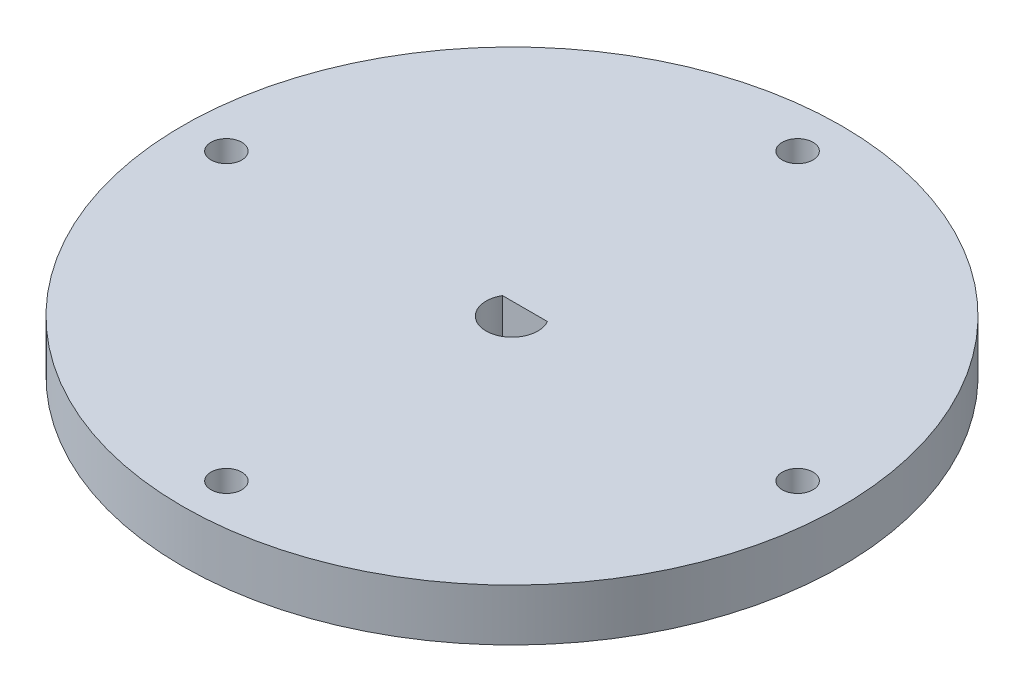
ISO-10303-21;
HEADER;
FILE_DESCRIPTION(('STEP AP214'),'2;1');
FILE_NAME('part.step','',(''),(''),'','','');
FILE_SCHEMA(('AUTOMOTIVE_DESIGN { 1 0 10303 214 1 1 1 1 }'));
ENDSEC;
DATA;
#1=APPLICATION_CONTEXT('core data for automotive mechanical design processes');
#2=APPLICATION_PROTOCOL_DEFINITION('international standard','automotive_design',2000,#1);
#3=PRODUCT_CONTEXT('',#1,'mechanical');
#4=PRODUCT('Part','Part','',(#3));
#5=PRODUCT_RELATED_PRODUCT_CATEGORY('part','',(#4));
#6=PRODUCT_DEFINITION_FORMATION('','',#4);
#7=PRODUCT_DEFINITION_CONTEXT('part definition',#1,'design');
#8=PRODUCT_DEFINITION('design','',#6,#7);
#9=PRODUCT_DEFINITION_SHAPE('','',#8);
#10=(LENGTH_UNIT() NAMED_UNIT(*) SI_UNIT(.MILLI.,.METRE.));
#11=(NAMED_UNIT(*) PLANE_ANGLE_UNIT() SI_UNIT($,.RADIAN.));
#12=(NAMED_UNIT(*) SI_UNIT($,.STERADIAN.) SOLID_ANGLE_UNIT());
#13=UNCERTAINTY_MEASURE_WITH_UNIT(LENGTH_MEASURE(1.E-05),#10,'distance_accuracy_value','');
#14=(GEOMETRIC_REPRESENTATION_CONTEXT(3) GLOBAL_UNCERTAINTY_ASSIGNED_CONTEXT((#13)) GLOBAL_UNIT_ASSIGNED_CONTEXT((#10,
#11,#12)) REPRESENTATION_CONTEXT('',''));
#15=CARTESIAN_POINT('',(0.,0.,0.));
#16=DIRECTION('',(0.,0.,1.));
#17=DIRECTION('',(1.,0.,0.));
#18=AXIS2_PLACEMENT_3D('',#15,#16,#17);
#19=CARTESIAN_POINT('',(0.,6.,0.));
#20=DIRECTION('',(0.,-1.,0.));
#21=DIRECTION('',(0.,0.,-1.));
#22=AXIS2_PLACEMENT_3D('',#19,#20,#21);
#23=CYLINDRICAL_SURFACE('',#22,38.1);
#24=CARTESIAN_POINT('',(0.,6.,0.));
#25=DIRECTION('',(0.,1.,0.));
#26=DIRECTION('',(0.,0.,1.));
#27=AXIS2_PLACEMENT_3D('',#24,#25,#26);
#28=CIRCLE('',#27,38.1);
#29=CARTESIAN_POINT('',(0.,6.,38.1));
#30=VERTEX_POINT('',#29);
#31=EDGE_CURVE('E11',#30,#30,#28,.T.);
#32=ORIENTED_EDGE('',*,*,#31,.F.);
#33=EDGE_LOOP('',(#32));
#34=FACE_BOUND('',#33,.T.);
#35=CARTESIAN_POINT('',(0.,0.,0.));
#36=DIRECTION('',(0.,1.,0.));
#37=DIRECTION('',(0.,0.,1.));
#38=AXIS2_PLACEMENT_3D('',#35,#36,#37);
#39=CIRCLE('',#38,38.1);
#40=CARTESIAN_POINT('',(0.,0.,38.1));
#41=VERTEX_POINT('',#40);
#42=EDGE_CURVE('E38',#41,#41,#39,.T.);
#43=ORIENTED_EDGE('',*,*,#42,.T.);
#44=EDGE_LOOP('',(#43));
#45=FACE_BOUND('',#44,.T.);
#46=ADVANCED_FACE('F35',(#34,#45),#23,.T.);
#47=CARTESIAN_POINT('',(0.,6.,0.));
#48=DIRECTION('',(0.,1.,0.));
#49=DIRECTION('',(0.,0.,1.));
#50=AXIS2_PLACEMENT_3D('',#47,#48,#49);
#51=PLANE('',#50);
#52=CARTESIAN_POINT('',(0.,6.,0.));
#53=DIRECTION('',(0.,1.,0.));
#54=DIRECTION('',(0.,0.,1.));
#55=AXIS2_PLACEMENT_3D('',#52,#53,#54);
#56=CIRCLE('',#55,3.);
#57=CARTESIAN_POINT('',(-2.59807621135332,6.,-1.5));
#58=VERTEX_POINT('',#57);
#59=CARTESIAN_POINT('',(2.59807621135332,6.,-1.5));
#60=VERTEX_POINT('',#59);
#61=EDGE_CURVE('E49',#58,#60,#56,.T.);
#62=ORIENTED_EDGE('',*,*,#61,.F.);
#63=DIRECTION('',(-1.,0.,0.));
#64=VECTOR('',#63,1.);
#65=CARTESIAN_POINT('',(-2.59807621135332,6.,-1.5));
#66=LINE('',#65,#64);
#67=EDGE_CURVE('E69',#60,#58,#66,.T.);
#68=ORIENTED_EDGE('',*,*,#67,.F.);
#69=EDGE_LOOP('',(#62,#68));
#70=FACE_BOUND('',#69,.T.);
#71=CARTESIAN_POINT('',(3.45866141425801E-13,6.,-33.02));
#72=DIRECTION('',(0.,1.,0.));
#73=DIRECTION('',(1.,0.,0.));
#74=AXIS2_PLACEMENT_3D('',#71,#72,#73);
#75=CIRCLE('',#74,1.778);
#76=CARTESIAN_POINT('',(1.77800000000035,6.,-33.02));
#77=VERTEX_POINT('',#76);
#78=EDGE_CURVE('E65',#77,#77,#75,.T.);
#79=ORIENTED_EDGE('',*,*,#78,.F.);
#80=EDGE_LOOP('',(#79));
#81=FACE_BOUND('',#80,.T.);
#82=CARTESIAN_POINT('',(-33.02,6.,0.));
#83=DIRECTION('',(0.,1.,0.));
#84=DIRECTION('',(0.,0.,-1.));
#85=AXIS2_PLACEMENT_3D('',#82,#83,#84);
#86=CIRCLE('',#85,1.778);
#87=CARTESIAN_POINT('',(-33.02,6.,-1.778));
#88=VERTEX_POINT('',#87);
#89=EDGE_CURVE('E84',#88,#88,#86,.T.);
#90=ORIENTED_EDGE('',*,*,#89,.F.);
#91=EDGE_LOOP('',(#90));
#92=FACE_BOUND('',#91,.T.);
#93=CARTESIAN_POINT('',(-1.152887138086E-13,6.,33.02));
#94=DIRECTION('',(0.,1.,0.));
#95=DIRECTION('',(-1.,0.,0.));
#96=AXIS2_PLACEMENT_3D('',#93,#94,#95);
#97=CIRCLE('',#96,1.778);
#98=CARTESIAN_POINT('',(-1.77800000000012,6.,33.02));
#99=VERTEX_POINT('',#98);
#100=EDGE_CURVE('E90',#99,#99,#97,.T.);
#101=ORIENTED_EDGE('',*,*,#100,.F.);
#102=EDGE_LOOP('',(#101));
#103=FACE_BOUND('',#102,.T.);
#104=CARTESIAN_POINT('',(33.02,6.,0.));
#105=DIRECTION('',(0.,1.,0.));
#106=DIRECTION('',(0.,0.,1.));
#107=AXIS2_PLACEMENT_3D('',#104,#105,#106);
#108=CIRCLE('',#107,1.778);
#109=CARTESIAN_POINT('',(33.02,6.,1.778));
#110=VERTEX_POINT('',#109);
#111=EDGE_CURVE('E96',#110,#110,#108,.T.);
#112=ORIENTED_EDGE('',*,*,#111,.F.);
#113=EDGE_LOOP('',(#112));
#114=FACE_BOUND('',#113,.T.);
#115=ORIENTED_EDGE('',*,*,#31,.T.);
#116=EDGE_LOOP('',(#115));
#117=FACE_BOUND('',#116,.T.);
#118=ADVANCED_FACE('F73',(#70,#81,#92,#103,#114,#117),#51,.T.);
#119=CARTESIAN_POINT('',(0.,0.,0.));
#120=DIRECTION('',(0.,1.,0.));
#121=DIRECTION('',(0.,0.,1.));
#122=AXIS2_PLACEMENT_3D('',#119,#120,#121);
#123=PLANE('',#122);
#124=DIRECTION('',(-1.,0.,0.));
#125=VECTOR('',#124,1.);
#126=CARTESIAN_POINT('',(-2.59807621135332,0.,-1.5));
#127=LINE('',#126,#125);
#128=CARTESIAN_POINT('',(2.59807621135332,0.,-1.5));
#129=VERTEX_POINT('',#128);
#130=CARTESIAN_POINT('',(-2.59807621135332,0.,-1.5));
#131=VERTEX_POINT('',#130);
#132=EDGE_CURVE('E77',#129,#131,#127,.T.);
#133=ORIENTED_EDGE('',*,*,#132,.T.);
#134=CARTESIAN_POINT('',(0.,0.,0.));
#135=DIRECTION('',(0.,1.,0.));
#136=DIRECTION('',(0.,0.,1.));
#137=AXIS2_PLACEMENT_3D('',#134,#135,#136);
#138=CIRCLE('',#137,3.);
#139=EDGE_CURVE('E54',#131,#129,#138,.T.);
#140=ORIENTED_EDGE('',*,*,#139,.T.);
#141=EDGE_LOOP('',(#133,#140));
#142=FACE_BOUND('',#141,.T.);
#143=CARTESIAN_POINT('',(3.45866141425801E-13,0.,-33.02));
#144=DIRECTION('',(0.,1.,0.));
#145=DIRECTION('',(1.,0.,0.));
#146=AXIS2_PLACEMENT_3D('',#143,#144,#145);
#147=CIRCLE('',#146,1.778);
#148=CARTESIAN_POINT('',(1.77800000000035,0.,-33.02));
#149=VERTEX_POINT('',#148);
#150=EDGE_CURVE('E81',#149,#149,#147,.T.);
#151=ORIENTED_EDGE('',*,*,#150,.T.);
#152=EDGE_LOOP('',(#151));
#153=FACE_BOUND('',#152,.T.);
#154=CARTESIAN_POINT('',(-33.02,0.,0.));
#155=DIRECTION('',(0.,1.,0.));
#156=DIRECTION('',(0.,0.,-1.));
#157=AXIS2_PLACEMENT_3D('',#154,#155,#156);
#158=CIRCLE('',#157,1.778);
#159=CARTESIAN_POINT('',(-33.02,0.,-1.778));
#160=VERTEX_POINT('',#159);
#161=EDGE_CURVE('E87',#160,#160,#158,.T.);
#162=ORIENTED_EDGE('',*,*,#161,.T.);
#163=EDGE_LOOP('',(#162));
#164=FACE_BOUND('',#163,.T.);
#165=CARTESIAN_POINT('',(-1.152887138086E-13,0.,33.02));
#166=DIRECTION('',(0.,1.,0.));
#167=DIRECTION('',(-1.,0.,0.));
#168=AXIS2_PLACEMENT_3D('',#165,#166,#167);
#169=CIRCLE('',#168,1.778);
#170=CARTESIAN_POINT('',(-1.77800000000012,0.,33.02));
#171=VERTEX_POINT('',#170);
#172=EDGE_CURVE('E93',#171,#171,#169,.T.);
#173=ORIENTED_EDGE('',*,*,#172,.T.);
#174=EDGE_LOOP('',(#173));
#175=FACE_BOUND('',#174,.T.);
#176=CARTESIAN_POINT('',(33.02,0.,0.));
#177=DIRECTION('',(0.,1.,0.));
#178=DIRECTION('',(0.,0.,1.));
#179=AXIS2_PLACEMENT_3D('',#176,#177,#178);
#180=CIRCLE('',#179,1.778);
#181=CARTESIAN_POINT('',(33.02,0.,1.778));
#182=VERTEX_POINT('',#181);
#183=EDGE_CURVE('E99',#182,#182,#180,.T.);
#184=ORIENTED_EDGE('',*,*,#183,.T.);
#185=EDGE_LOOP('',(#184));
#186=FACE_BOUND('',#185,.T.);
#187=ORIENTED_EDGE('',*,*,#42,.F.);
#188=EDGE_LOOP('',(#187));
#189=FACE_BOUND('',#188,.T.);
#190=ADVANCED_FACE('F109',(#142,#153,#164,#175,#186,#189),#123,.F.);
#191=CARTESIAN_POINT('',(33.02,0.,0.));
#192=DIRECTION('',(0.,1.,0.));
#193=DIRECTION('',(0.,0.,1.));
#194=AXIS2_PLACEMENT_3D('',#191,#192,#193);
#195=CYLINDRICAL_SURFACE('',#194,1.778);
#196=ORIENTED_EDGE('',*,*,#183,.F.);
#197=EDGE_LOOP('',(#196));
#198=FACE_BOUND('',#197,.T.);
#199=ORIENTED_EDGE('',*,*,#111,.T.);
#200=EDGE_LOOP('',(#199));
#201=FACE_BOUND('',#200,.T.);
#202=ADVANCED_FACE('F105',(#198,#201),#195,.F.);
#203=CARTESIAN_POINT('',(-1.152887138086E-13,0.,33.02));
#204=DIRECTION('',(0.,1.,0.));
#205=DIRECTION('',(0.,0.,1.));
#206=AXIS2_PLACEMENT_3D('',#203,#204,#205);
#207=CYLINDRICAL_SURFACE('',#206,1.778);
#208=ORIENTED_EDGE('',*,*,#172,.F.);
#209=EDGE_LOOP('',(#208));
#210=FACE_BOUND('',#209,.T.);
#211=ORIENTED_EDGE('',*,*,#100,.T.);
#212=EDGE_LOOP('',(#211));
#213=FACE_BOUND('',#212,.T.);
#214=ADVANCED_FACE('F123',(#210,#213),#207,.F.);
#215=CARTESIAN_POINT('',(-33.02,0.,0.));
#216=DIRECTION('',(0.,1.,0.));
#217=DIRECTION('',(0.,0.,1.));
#218=AXIS2_PLACEMENT_3D('',#215,#216,#217);
#219=CYLINDRICAL_SURFACE('',#218,1.778);
#220=ORIENTED_EDGE('',*,*,#161,.F.);
#221=EDGE_LOOP('',(#220));
#222=FACE_BOUND('',#221,.T.);
#223=ORIENTED_EDGE('',*,*,#89,.T.);
#224=EDGE_LOOP('',(#223));
#225=FACE_BOUND('',#224,.T.);
#226=ADVANCED_FACE('F130',(#222,#225),#219,.F.);
#227=CARTESIAN_POINT('',(3.45866141425801E-13,0.,-33.02));
#228=DIRECTION('',(0.,1.,0.));
#229=DIRECTION('',(0.,0.,1.));
#230=AXIS2_PLACEMENT_3D('',#227,#228,#229);
#231=CYLINDRICAL_SURFACE('',#230,1.778);
#232=ORIENTED_EDGE('',*,*,#150,.F.);
#233=EDGE_LOOP('',(#232));
#234=FACE_BOUND('',#233,.T.);
#235=ORIENTED_EDGE('',*,*,#78,.T.);
#236=EDGE_LOOP('',(#235));
#237=FACE_BOUND('',#236,.T.);
#238=ADVANCED_FACE('F134',(#234,#237),#231,.F.);
#239=CARTESIAN_POINT('',(0.,0.,0.));
#240=DIRECTION('',(0.,1.,0.));
#241=DIRECTION('',(0.,0.,1.));
#242=AXIS2_PLACEMENT_3D('',#239,#240,#241);
#243=CYLINDRICAL_SURFACE('',#242,3.);
#244=ORIENTED_EDGE('',*,*,#61,.T.);
#245=DIRECTION('',(0.,1.,0.));
#246=VECTOR('',#245,1.);
#247=CARTESIAN_POINT('',(2.59807621135332,0.,-1.5));
#248=LINE('',#247,#246);
#249=EDGE_CURVE('E66',#129,#60,#248,.T.);
#250=ORIENTED_EDGE('',*,*,#249,.F.);
#251=ORIENTED_EDGE('',*,*,#139,.F.);
#252=DIRECTION('',(0.,1.,0.));
#253=VECTOR('',#252,1.);
#254=CARTESIAN_POINT('',(-2.59807621135332,0.,-1.5));
#255=LINE('',#254,#253);
#256=EDGE_CURVE('E59',#131,#58,#255,.T.);
#257=ORIENTED_EDGE('',*,*,#256,.T.);
#258=EDGE_LOOP('',(#244,#250,#251,#257));
#259=FACE_BOUND('',#258,.T.);
#260=ADVANCED_FACE('F61',(#259),#243,.F.);
#261=CARTESIAN_POINT('',(-2.59807621135332,0.,-1.5));
#262=DIRECTION('',(0.,0.,-1.));
#263=DIRECTION('',(-1.,0.,0.));
#264=AXIS2_PLACEMENT_3D('',#261,#262,#263);
#265=PLANE('',#264);
#266=ORIENTED_EDGE('',*,*,#67,.T.);
#267=ORIENTED_EDGE('',*,*,#256,.F.);
#268=ORIENTED_EDGE('',*,*,#132,.F.);
#269=ORIENTED_EDGE('',*,*,#249,.T.);
#270=EDGE_LOOP('',(#266,#267,#268,#269));
#271=FACE_BOUND('',#270,.T.);
#272=ADVANCED_FACE('F70',(#271),#265,.F.);
#273=CLOSED_SHELL('',(#46,#118,#190,#202,#214,#226,#238,#260,#272));
#274=MANIFOLD_SOLID_BREP('B2',#273);
#275=ADVANCED_BREP_SHAPE_REPRESENTATION('',(#18,#274),#14);
#276=SHAPE_DEFINITION_REPRESENTATION(#9,#275);
ENDSEC;
END-ISO-10303-21;
